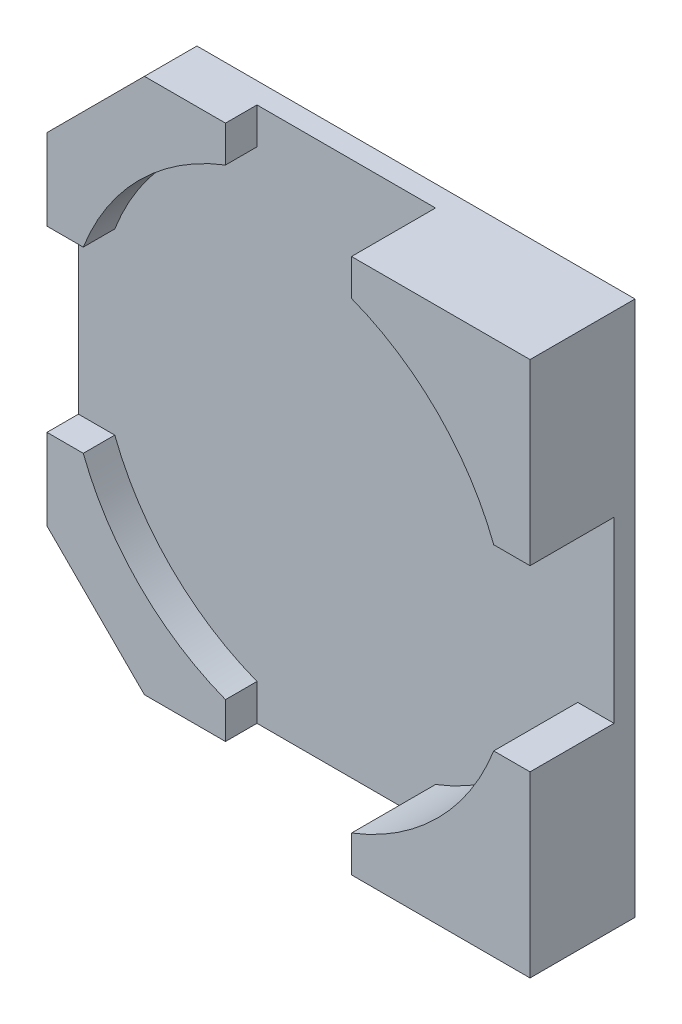
ISO-10303-21;
HEADER;
FILE_DESCRIPTION(('STEP AP214'),'2;1');
FILE_NAME('part.step','',(''),(''),'','','');
FILE_SCHEMA(('AUTOMOTIVE_DESIGN { 1 0 10303 214 1 1 1 1 }'));
ENDSEC;
DATA;
#1=APPLICATION_CONTEXT('core data for automotive mechanical design processes');
#2=APPLICATION_PROTOCOL_DEFINITION('international standard','automotive_design',2000,#1);
#3=PRODUCT_CONTEXT('',#1,'mechanical');
#4=PRODUCT('Part','Part','',(#3));
#5=PRODUCT_RELATED_PRODUCT_CATEGORY('part','',(#4));
#6=PRODUCT_DEFINITION_FORMATION('','',#4);
#7=PRODUCT_DEFINITION_CONTEXT('part definition',#1,'design');
#8=PRODUCT_DEFINITION('design','',#6,#7);
#9=PRODUCT_DEFINITION_SHAPE('','',#8);
#10=(LENGTH_UNIT() NAMED_UNIT(*) SI_UNIT(.MILLI.,.METRE.));
#11=(NAMED_UNIT(*) PLANE_ANGLE_UNIT() SI_UNIT($,.RADIAN.));
#12=(NAMED_UNIT(*) SI_UNIT($,.STERADIAN.) SOLID_ANGLE_UNIT());
#13=UNCERTAINTY_MEASURE_WITH_UNIT(LENGTH_MEASURE(1.E-05),#10,'distance_accuracy_value','');
#14=(GEOMETRIC_REPRESENTATION_CONTEXT(3) GLOBAL_UNCERTAINTY_ASSIGNED_CONTEXT((#13)) GLOBAL_UNIT_ASSIGNED_CONTEXT((#10,
#11,#12)) REPRESENTATION_CONTEXT('',''));
#15=CARTESIAN_POINT('',(0.,0.,0.));
#16=DIRECTION('',(0.,0.,1.));
#17=DIRECTION('',(1.,0.,0.));
#18=AXIS2_PLACEMENT_3D('',#15,#16,#17);
#19=CARTESIAN_POINT('',(0.,0.,0.266633333333));
#20=DIRECTION('',(0.,0.,1.));
#21=DIRECTION('',(1.,0.,0.));
#22=AXIS2_PLACEMENT_3D('',#19,#20,#21);
#23=CYLINDRICAL_SURFACE('',#22,3.15);
#24=CARTESIAN_POINT('',(0.,0.,0.666583333333));
#25=DIRECTION('',(0.,0.,1.));
#26=DIRECTION('',(1.,0.,0.));
#27=AXIS2_PLACEMENT_3D('',#24,#25,#26);
#28=CIRCLE('',#27,3.15);
#29=CARTESIAN_POINT('',(-1.13333333333295,-2.93905691601174,0.666583333333));
#30=VERTEX_POINT('',#29);
#31=CARTESIAN_POINT('',(-2.93905691601186,-1.133333333333,0.666583333333));
#32=VERTEX_POINT('',#31);
#33=EDGE_CURVE('E211',#30,#32,#28,.F.);
#34=ORIENTED_EDGE('',*,*,#33,.F.);
#35=DIRECTION('',(0.,0.,1.));
#36=VECTOR('',#35,1.);
#37=CARTESIAN_POINT('',(-1.13333333333291,-2.93905691601175,0.266633333333));
#38=LINE('',#37,#36);
#39=CARTESIAN_POINT('',(-1.133333333333,-2.93905691601186,0.266633333333));
#40=VERTEX_POINT('',#39);
#41=EDGE_CURVE('E345',#40,#30,#38,.T.);
#42=ORIENTED_EDGE('',*,*,#41,.F.);
#43=CARTESIAN_POINT('',(0.,0.,0.266633333333));
#44=DIRECTION('',(0.,0.,1.));
#45=DIRECTION('',(1.,0.,0.));
#46=AXIS2_PLACEMENT_3D('',#43,#44,#45);
#47=CIRCLE('',#46,3.15);
#48=CARTESIAN_POINT('',(-2.93905691601186,-1.133333333333,0.266633333333));
#49=VERTEX_POINT('',#48);
#50=EDGE_CURVE('E20',#49,#40,#47,.T.);
#51=ORIENTED_EDGE('',*,*,#50,.F.);
#52=DIRECTION('',(0.,0.,1.));
#53=VECTOR('',#52,1.);
#54=CARTESIAN_POINT('',(-2.939056916012,-1.133333333333,0.266633333333));
#55=LINE('',#54,#53);
#56=EDGE_CURVE('E216',#32,#49,#55,.F.);
#57=ORIENTED_EDGE('',*,*,#56,.F.);
#58=EDGE_LOOP('',(#34,#42,#51,#57));
#59=FACE_BOUND('',#58,.T.);
#60=ADVANCED_FACE('F17',(#59),#23,.F.);
#61=CARTESIAN_POINT('',(0.,0.,0.266633333333));
#62=DIRECTION('',(0.,0.,1.));
#63=DIRECTION('',(1.,0.,0.));
#64=AXIS2_PLACEMENT_3D('',#61,#62,#63);
#65=CYLINDRICAL_SURFACE('',#64,3.15);
#66=CARTESIAN_POINT('',(0.,0.,1.333166666667));
#67=DIRECTION('',(0.,0.,1.));
#68=DIRECTION('',(1.,0.,0.));
#69=AXIS2_PLACEMENT_3D('',#66,#67,#68);
#70=CIRCLE('',#69,3.15);
#71=CARTESIAN_POINT('',(2.93905691601174,-1.13333333333295,1.333166666667));
#72=VERTEX_POINT('',#71);
#73=CARTESIAN_POINT('',(1.133333333333,-2.93905691601186,1.333166666667));
#74=VERTEX_POINT('',#73);
#75=EDGE_CURVE('E200',#72,#74,#70,.F.);
#76=ORIENTED_EDGE('',*,*,#75,.F.);
#77=DIRECTION('',(0.,0.,1.));
#78=VECTOR('',#77,1.);
#79=CARTESIAN_POINT('',(2.93905691601175,-1.13333333333291,0.266633333333));
#80=LINE('',#79,#78);
#81=CARTESIAN_POINT('',(2.93905691601186,-1.133333333333,0.266633333333));
#82=VERTEX_POINT('',#81);
#83=EDGE_CURVE('E174',#82,#72,#80,.T.);
#84=ORIENTED_EDGE('',*,*,#83,.F.);
#85=CARTESIAN_POINT('',(0.,0.,0.266633333333));
#86=DIRECTION('',(0.,0.,1.));
#87=DIRECTION('',(1.,0.,0.));
#88=AXIS2_PLACEMENT_3D('',#85,#86,#87);
#89=CIRCLE('',#88,3.15);
#90=CARTESIAN_POINT('',(1.133333333333,-2.93905691601186,0.266633333333));
#91=VERTEX_POINT('',#90);
#92=EDGE_CURVE('E308',#91,#82,#89,.T.);
#93=ORIENTED_EDGE('',*,*,#92,.F.);
#94=DIRECTION('',(0.,0.,-1.));
#95=VECTOR('',#94,1.);
#96=CARTESIAN_POINT('',(1.133333333333,-2.939056916012,0.266633333333));
#97=LINE('',#96,#95);
#98=EDGE_CURVE('E294',#91,#74,#97,.F.);
#99=ORIENTED_EDGE('',*,*,#98,.T.);
#100=EDGE_LOOP('',(#76,#84,#93,#99));
#101=FACE_BOUND('',#100,.T.);
#102=ADVANCED_FACE('F375',(#101),#65,.F.);
#103=CARTESIAN_POINT('',(0.,0.,0.266633333333));
#104=DIRECTION('',(0.,0.,1.));
#105=DIRECTION('',(1.,0.,0.));
#106=AXIS2_PLACEMENT_3D('',#103,#104,#105);
#107=CYLINDRICAL_SURFACE('',#106,3.15);
#108=DIRECTION('',(0.,0.,-1.));
#109=VECTOR('',#108,1.);
#110=CARTESIAN_POINT('',(1.133333333333,2.939056916012,0.266633333333));
#111=LINE('',#110,#109);
#112=CARTESIAN_POINT('',(1.133333333333,2.93905691601186,1.333166666667));
#113=VERTEX_POINT('',#112);
#114=CARTESIAN_POINT('',(1.133333333333,2.93905691601186,0.266633333333));
#115=VERTEX_POINT('',#114);
#116=EDGE_CURVE('E168',#113,#115,#111,.T.);
#117=ORIENTED_EDGE('',*,*,#116,.T.);
#118=CARTESIAN_POINT('',(0.,0.,0.266633333333));
#119=DIRECTION('',(0.,0.,1.));
#120=DIRECTION('',(1.,0.,0.));
#121=AXIS2_PLACEMENT_3D('',#118,#119,#120);
#122=CIRCLE('',#121,3.15);
#123=CARTESIAN_POINT('',(2.93905691601186,1.133333333333,0.266633333333));
#124=VERTEX_POINT('',#123);
#125=EDGE_CURVE('E162',#124,#115,#122,.T.);
#126=ORIENTED_EDGE('',*,*,#125,.F.);
#127=DIRECTION('',(0.,0.,1.));
#128=VECTOR('',#127,1.);
#129=CARTESIAN_POINT('',(2.939056916012,1.133333333333,0.266633333333));
#130=LINE('',#129,#128);
#131=CARTESIAN_POINT('',(2.93905691601186,1.133333333333,1.333166666667));
#132=VERTEX_POINT('',#131);
#133=EDGE_CURVE('E166',#124,#132,#130,.T.);
#134=ORIENTED_EDGE('',*,*,#133,.T.);
#135=CARTESIAN_POINT('',(0.,0.,1.333166666667));
#136=DIRECTION('',(0.,0.,1.));
#137=DIRECTION('',(1.,0.,0.));
#138=AXIS2_PLACEMENT_3D('',#135,#136,#137);
#139=CIRCLE('',#138,3.15);
#140=EDGE_CURVE('E365',#113,#132,#139,.F.);
#141=ORIENTED_EDGE('',*,*,#140,.F.);
#142=EDGE_LOOP('',(#117,#126,#134,#141));
#143=FACE_BOUND('',#142,.T.);
#144=ADVANCED_FACE('F164',(#143),#107,.F.);
#145=CARTESIAN_POINT('',(0.,0.,0.266633333333));
#146=DIRECTION('',(0.,0.,1.));
#147=DIRECTION('',(1.,0.,0.));
#148=AXIS2_PLACEMENT_3D('',#145,#146,#147);
#149=CYLINDRICAL_SURFACE('',#148,3.15);
#150=DIRECTION('',(0.,0.,1.));
#151=VECTOR('',#150,1.);
#152=CARTESIAN_POINT('',(-2.939056916012,1.133333333333,0.266633333333));
#153=LINE('',#152,#151);
#154=CARTESIAN_POINT('',(-2.93905691601186,1.133333333333,0.666583333333));
#155=VERTEX_POINT('',#154);
#156=CARTESIAN_POINT('',(-2.93905691601186,1.133333333333,0.266633333333));
#157=VERTEX_POINT('',#156);
#158=EDGE_CURVE('E217',#155,#157,#153,.F.);
#159=ORIENTED_EDGE('',*,*,#158,.T.);
#160=CARTESIAN_POINT('',(0.,0.,0.266633333333));
#161=DIRECTION('',(0.,0.,1.));
#162=DIRECTION('',(1.,0.,0.));
#163=AXIS2_PLACEMENT_3D('',#160,#161,#162);
#164=CIRCLE('',#163,3.15);
#165=CARTESIAN_POINT('',(-1.133333333333,2.93905691601186,0.266633333333));
#166=VERTEX_POINT('',#165);
#167=EDGE_CURVE('E173',#166,#157,#164,.T.);
#168=ORIENTED_EDGE('',*,*,#167,.F.);
#169=DIRECTION('',(0.,0.,-1.));
#170=VECTOR('',#169,1.);
#171=CARTESIAN_POINT('',(-1.133333333333,2.939056916012,0.266633333333));
#172=LINE('',#171,#170);
#173=CARTESIAN_POINT('',(-1.133333333333,2.93905691601186,0.666583333333));
#174=VERTEX_POINT('',#173);
#175=EDGE_CURVE('E220',#174,#166,#172,.T.);
#176=ORIENTED_EDGE('',*,*,#175,.F.);
#177=CARTESIAN_POINT('',(0.,0.,0.666583333333));
#178=DIRECTION('',(0.,0.,1.));
#179=DIRECTION('',(1.,0.,0.));
#180=AXIS2_PLACEMENT_3D('',#177,#178,#179);
#181=CIRCLE('',#180,3.15);
#182=EDGE_CURVE('E362',#155,#174,#181,.F.);
#183=ORIENTED_EDGE('',*,*,#182,.F.);
#184=EDGE_LOOP('',(#159,#168,#176,#183));
#185=FACE_BOUND('',#184,.T.);
#186=ADVANCED_FACE('F423',(#185),#149,.F.);
#187=CARTESIAN_POINT('',(-3.4,1.133333333333,0.266633333333));
#188=DIRECTION('',(0.,1.,0.));
#189=DIRECTION('',(0.,0.,1.));
#190=AXIS2_PLACEMENT_3D('',#187,#188,#189);
#191=PLANE('',#190);
#192=ORIENTED_EDGE('',*,*,#158,.F.);
#193=DIRECTION('',(1.,0.,0.));
#194=VECTOR('',#193,1.);
#195=CARTESIAN_POINT('',(-3.4,1.133333333333,0.666583333333));
#196=LINE('',#195,#194);
#197=CARTESIAN_POINT('',(-3.4,1.133333333333,0.666583333333));
#198=VERTEX_POINT('',#197);
#199=EDGE_CURVE('E364',#198,#155,#196,.T.);
#200=ORIENTED_EDGE('',*,*,#199,.F.);
#201=DIRECTION('',(0.,0.,-1.));
#202=VECTOR('',#201,1.);
#203=CARTESIAN_POINT('',(-3.4,1.133333333333,0.));
#204=LINE('',#203,#202);
#205=CARTESIAN_POINT('',(-3.4,1.133333333333,0.266633333333));
#206=VERTEX_POINT('',#205);
#207=EDGE_CURVE('E237',#198,#206,#204,.T.);
#208=ORIENTED_EDGE('',*,*,#207,.T.);
#209=DIRECTION('',(1.,0.,0.));
#210=VECTOR('',#209,1.);
#211=CARTESIAN_POINT('',(-3.4,1.133333333333,0.266633333333));
#212=LINE('',#211,#210);
#213=EDGE_CURVE('E214',#157,#206,#212,.F.);
#214=ORIENTED_EDGE('',*,*,#213,.F.);
#215=EDGE_LOOP('',(#192,#200,#208,#214));
#216=FACE_BOUND('',#215,.T.);
#217=ADVANCED_FACE('F426',(#216),#191,.F.);
#218=CARTESIAN_POINT('',(-3.4,-1.133333333333,0.266633333333));
#219=DIRECTION('',(0.,1.,0.));
#220=DIRECTION('',(0.,0.,1.));
#221=AXIS2_PLACEMENT_3D('',#218,#219,#220);
#222=PLANE('',#221);
#223=ORIENTED_EDGE('',*,*,#56,.T.);
#224=DIRECTION('',(1.,0.,0.));
#225=VECTOR('',#224,1.);
#226=CARTESIAN_POINT('',(-3.4,-1.133333333333,0.266633333333));
#227=LINE('',#226,#225);
#228=CARTESIAN_POINT('',(-3.4,-1.133333333333,0.266633333333));
#229=VERTEX_POINT('',#228);
#230=EDGE_CURVE('E329',#49,#229,#227,.F.);
#231=ORIENTED_EDGE('',*,*,#230,.T.);
#232=DIRECTION('',(0.,0.,-1.));
#233=VECTOR('',#232,1.);
#234=CARTESIAN_POINT('',(-3.4,-1.133333333333,0.));
#235=LINE('',#234,#233);
#236=CARTESIAN_POINT('',(-3.4,-1.133333333333,0.666583333333));
#237=VERTEX_POINT('',#236);
#238=EDGE_CURVE('E339',#229,#237,#235,.F.);
#239=ORIENTED_EDGE('',*,*,#238,.T.);
#240=DIRECTION('',(1.,0.,0.));
#241=VECTOR('',#240,1.);
#242=CARTESIAN_POINT('',(-3.4,-1.133333333333,0.666583333333));
#243=LINE('',#242,#241);
#244=EDGE_CURVE('E209',#32,#237,#243,.F.);
#245=ORIENTED_EDGE('',*,*,#244,.F.);
#246=EDGE_LOOP('',(#223,#231,#239,#245));
#247=FACE_BOUND('',#246,.T.);
#248=ADVANCED_FACE('F437',(#247),#222,.T.);
#249=CARTESIAN_POINT('',(-3.4,-3.4,0.666583333333));
#250=DIRECTION('',(0.,0.,1.));
#251=DIRECTION('',(1.,0.,0.));
#252=AXIS2_PLACEMENT_3D('',#249,#250,#251);
#253=PLANE('',#252);
#254=ORIENTED_EDGE('',*,*,#33,.T.);
#255=ORIENTED_EDGE('',*,*,#244,.T.);
#256=DIRECTION('',(0.,1.,0.));
#257=VECTOR('',#256,1.);
#258=CARTESIAN_POINT('',(-3.4,-3.4,0.666583333333));
#259=LINE('',#258,#257);
#260=CARTESIAN_POINT('',(-3.4,-2.1625,0.666583333333));
#261=VERTEX_POINT('',#260);
#262=EDGE_CURVE('E246',#237,#261,#259,.F.);
#263=ORIENTED_EDGE('',*,*,#262,.T.);
#264=DIRECTION('',(0.707106781186548,-0.707106781186548,0.));
#265=VECTOR('',#264,1.);
#266=CARTESIAN_POINT('',(-2.1625,-3.4,0.666583333333));
#267=LINE('',#266,#265);
#268=CARTESIAN_POINT('',(-2.1625,-3.4,0.666583333333));
#269=VERTEX_POINT('',#268);
#270=EDGE_CURVE('E342',#269,#261,#267,.F.);
#271=ORIENTED_EDGE('',*,*,#270,.F.);
#272=DIRECTION('',(1.,0.,0.));
#273=VECTOR('',#272,1.);
#274=CARTESIAN_POINT('',(-3.4,-3.4,0.666583333333));
#275=LINE('',#274,#273);
#276=CARTESIAN_POINT('',(-1.133333333333,-3.4,0.666583333333));
#277=VERTEX_POINT('',#276);
#278=EDGE_CURVE('E327',#269,#277,#275,.T.);
#279=ORIENTED_EDGE('',*,*,#278,.T.);
#280=DIRECTION('',(0.,1.,0.));
#281=VECTOR('',#280,1.);
#282=CARTESIAN_POINT('',(-1.133333333333,-3.4,0.666583333333));
#283=LINE('',#282,#281);
#284=EDGE_CURVE('E206',#30,#277,#283,.F.);
#285=ORIENTED_EDGE('',*,*,#284,.F.);
#286=EDGE_LOOP('',(#254,#255,#263,#271,#279,#285));
#287=FACE_BOUND('',#286,.T.);
#288=ADVANCED_FACE('F449',(#287),#253,.T.);
#289=CARTESIAN_POINT('',(-1.133333333333,-3.4,0.266633333333));
#290=DIRECTION('',(1.,0.,0.));
#291=DIRECTION('',(0.,0.,-1.));
#292=AXIS2_PLACEMENT_3D('',#289,#290,#291);
#293=PLANE('',#292);
#294=ORIENTED_EDGE('',*,*,#41,.T.);
#295=ORIENTED_EDGE('',*,*,#284,.T.);
#296=DIRECTION('',(0.,0.,1.));
#297=VECTOR('',#296,1.);
#298=CARTESIAN_POINT('',(-1.133333333333,-3.4,0.));
#299=LINE('',#298,#297);
#300=CARTESIAN_POINT('',(-1.133333333333,-3.4,0.266633333333));
#301=VERTEX_POINT('',#300);
#302=EDGE_CURVE('E315',#277,#301,#299,.F.);
#303=ORIENTED_EDGE('',*,*,#302,.T.);
#304=DIRECTION('',(0.,1.,0.));
#305=VECTOR('',#304,1.);
#306=CARTESIAN_POINT('',(-1.133333333333,-3.4,0.266633333333));
#307=LINE('',#306,#305);
#308=EDGE_CURVE('E203',#40,#301,#307,.F.);
#309=ORIENTED_EDGE('',*,*,#308,.F.);
#310=EDGE_LOOP('',(#294,#295,#303,#309));
#311=FACE_BOUND('',#310,.T.);
#312=ADVANCED_FACE('F445',(#311),#293,.T.);
#313=CARTESIAN_POINT('',(1.133333333333,-3.4,0.266633333333));
#314=DIRECTION('',(1.,0.,0.));
#315=DIRECTION('',(0.,0.,-1.));
#316=AXIS2_PLACEMENT_3D('',#313,#314,#315);
#317=PLANE('',#316);
#318=ORIENTED_EDGE('',*,*,#98,.F.);
#319=DIRECTION('',(0.,1.,0.));
#320=VECTOR('',#319,1.);
#321=CARTESIAN_POINT('',(1.133333333333,-3.4,0.266633333333));
#322=LINE('',#321,#320);
#323=CARTESIAN_POINT('',(1.133333333333,-3.4,0.266633333333));
#324=VERTEX_POINT('',#323);
#325=EDGE_CURVE('E205',#324,#91,#322,.T.);
#326=ORIENTED_EDGE('',*,*,#325,.F.);
#327=DIRECTION('',(0.,0.,1.));
#328=VECTOR('',#327,1.);
#329=CARTESIAN_POINT('',(1.133333333333,-3.4,0.));
#330=LINE('',#329,#328);
#331=CARTESIAN_POINT('',(1.133333333333,-3.4,1.333166666667));
#332=VERTEX_POINT('',#331);
#333=EDGE_CURVE('E299',#324,#332,#330,.T.);
#334=ORIENTED_EDGE('',*,*,#333,.T.);
#335=DIRECTION('',(0.,1.,0.));
#336=VECTOR('',#335,1.);
#337=CARTESIAN_POINT('',(1.133333333333,-3.4,1.333166666667));
#338=LINE('',#337,#336);
#339=EDGE_CURVE('E183',#74,#332,#338,.F.);
#340=ORIENTED_EDGE('',*,*,#339,.F.);
#341=EDGE_LOOP('',(#318,#326,#334,#340));
#342=FACE_BOUND('',#341,.T.);
#343=ADVANCED_FACE('F378',(#342),#317,.F.);
#344=CARTESIAN_POINT('',(-3.4,-3.4,1.333166666667));
#345=DIRECTION('',(0.,0.,1.));
#346=DIRECTION('',(1.,0.,0.));
#347=AXIS2_PLACEMENT_3D('',#344,#345,#346);
#348=PLANE('',#347);
#349=ORIENTED_EDGE('',*,*,#339,.T.);
#350=DIRECTION('',(1.,0.,0.));
#351=VECTOR('',#350,1.);
#352=CARTESIAN_POINT('',(-3.4,-3.4,1.333166666667));
#353=LINE('',#352,#351);
#354=CARTESIAN_POINT('',(3.4,-3.4,1.333166666667));
#355=VERTEX_POINT('',#354);
#356=EDGE_CURVE('E286',#332,#355,#353,.T.);
#357=ORIENTED_EDGE('',*,*,#356,.T.);
#358=DIRECTION('',(0.,1.,0.));
#359=VECTOR('',#358,1.);
#360=CARTESIAN_POINT('',(3.4,-3.4,1.333166666667));
#361=LINE('',#360,#359);
#362=CARTESIAN_POINT('',(3.4,-1.133333333333,1.333166666667));
#363=VERTEX_POINT('',#362);
#364=EDGE_CURVE('E284',#363,#355,#361,.F.);
#365=ORIENTED_EDGE('',*,*,#364,.F.);
#366=DIRECTION('',(1.,0.,0.));
#367=VECTOR('',#366,1.);
#368=CARTESIAN_POINT('',(-3.4,-1.133333333333,1.333166666667));
#369=LINE('',#368,#367);
#370=EDGE_CURVE('E191',#72,#363,#369,.T.);
#371=ORIENTED_EDGE('',*,*,#370,.F.);
#372=ORIENTED_EDGE('',*,*,#75,.T.);
#373=EDGE_LOOP('',(#349,#357,#365,#371,#372));
#374=FACE_BOUND('',#373,.T.);
#375=ADVANCED_FACE('F382',(#374),#348,.T.);
#376=CARTESIAN_POINT('',(-3.4,1.133333333333,0.266633333333));
#377=DIRECTION('',(0.,1.,0.));
#378=DIRECTION('',(0.,0.,1.));
#379=AXIS2_PLACEMENT_3D('',#376,#377,#378);
#380=PLANE('',#379);
#381=ORIENTED_EDGE('',*,*,#133,.F.);
#382=DIRECTION('',(1.,0.,0.));
#383=VECTOR('',#382,1.);
#384=CARTESIAN_POINT('',(-3.4,1.133333333333,0.266633333333));
#385=LINE('',#384,#383);
#386=CARTESIAN_POINT('',(3.4,1.133333333333,0.266633333333));
#387=VERTEX_POINT('',#386);
#388=EDGE_CURVE('E180',#387,#124,#385,.F.);
#389=ORIENTED_EDGE('',*,*,#388,.F.);
#390=DIRECTION('',(0.,0.,-1.));
#391=VECTOR('',#390,1.);
#392=CARTESIAN_POINT('',(3.4,1.133333333333,0.));
#393=LINE('',#392,#391);
#394=CARTESIAN_POINT('',(3.4,1.133333333333,1.333166666667));
#395=VERTEX_POINT('',#394);
#396=EDGE_CURVE('E252',#395,#387,#393,.T.);
#397=ORIENTED_EDGE('',*,*,#396,.F.);
#398=DIRECTION('',(1.,0.,0.));
#399=VECTOR('',#398,1.);
#400=CARTESIAN_POINT('',(-3.4,1.133333333333,1.333166666667));
#401=LINE('',#400,#399);
#402=EDGE_CURVE('E182',#132,#395,#401,.T.);
#403=ORIENTED_EDGE('',*,*,#402,.F.);
#404=EDGE_LOOP('',(#381,#389,#397,#403));
#405=FACE_BOUND('',#404,.T.);
#406=ADVANCED_FACE('F178',(#405),#380,.F.);
#407=CARTESIAN_POINT('',(-3.4,-1.133333333333,0.266633333333));
#408=DIRECTION('',(0.,1.,0.));
#409=DIRECTION('',(0.,0.,1.));
#410=AXIS2_PLACEMENT_3D('',#407,#408,#409);
#411=PLANE('',#410);
#412=ORIENTED_EDGE('',*,*,#83,.T.);
#413=ORIENTED_EDGE('',*,*,#370,.T.);
#414=DIRECTION('',(0.,0.,-1.));
#415=VECTOR('',#414,1.);
#416=CARTESIAN_POINT('',(3.4,-1.133333333333,0.));
#417=LINE('',#416,#415);
#418=CARTESIAN_POINT('',(3.4,-1.133333333333,0.266633333333));
#419=VERTEX_POINT('',#418);
#420=EDGE_CURVE('E228',#419,#363,#417,.F.);
#421=ORIENTED_EDGE('',*,*,#420,.F.);
#422=DIRECTION('',(1.,0.,0.));
#423=VECTOR('',#422,1.);
#424=CARTESIAN_POINT('',(-3.4,-1.133333333333,0.266633333333));
#425=LINE('',#424,#423);
#426=EDGE_CURVE('E188',#419,#82,#425,.F.);
#427=ORIENTED_EDGE('',*,*,#426,.T.);
#428=EDGE_LOOP('',(#412,#413,#421,#427));
#429=FACE_BOUND('',#428,.T.);
#430=ADVANCED_FACE('F580',(#429),#411,.T.);
#431=CARTESIAN_POINT('',(-1.133333333333,-3.4,0.266633333333));
#432=DIRECTION('',(1.,0.,0.));
#433=DIRECTION('',(0.,0.,-1.));
#434=AXIS2_PLACEMENT_3D('',#431,#432,#433);
#435=PLANE('',#434);
#436=ORIENTED_EDGE('',*,*,#175,.T.);
#437=DIRECTION('',(0.,1.,0.));
#438=VECTOR('',#437,1.);
#439=CARTESIAN_POINT('',(-1.133333333333,-3.4,0.266633333333));
#440=LINE('',#439,#438);
#441=CARTESIAN_POINT('',(-1.133333333333,3.4,0.266633333333));
#442=VERTEX_POINT('',#441);
#443=EDGE_CURVE('E223',#442,#166,#440,.F.);
#444=ORIENTED_EDGE('',*,*,#443,.F.);
#445=DIRECTION('',(0.,0.,1.));
#446=VECTOR('',#445,1.);
#447=CARTESIAN_POINT('',(-1.133333333333,3.4,0.));
#448=LINE('',#447,#446);
#449=CARTESIAN_POINT('',(-1.133333333333,3.4,0.666583333333));
#450=VERTEX_POINT('',#449);
#451=EDGE_CURVE('E227',#450,#442,#448,.F.);
#452=ORIENTED_EDGE('',*,*,#451,.F.);
#453=DIRECTION('',(0.,1.,0.));
#454=VECTOR('',#453,1.);
#455=CARTESIAN_POINT('',(-1.133333333333,-3.4,0.666583333333));
#456=LINE('',#455,#454);
#457=EDGE_CURVE('E336',#174,#450,#456,.T.);
#458=ORIENTED_EDGE('',*,*,#457,.F.);
#459=EDGE_LOOP('',(#436,#444,#452,#458));
#460=FACE_BOUND('',#459,.T.);
#461=ADVANCED_FACE('F418',(#460),#435,.T.);
#462=CARTESIAN_POINT('',(-1.133333333333,-3.4,0.266633333333));
#463=DIRECTION('',(0.,0.,1.));
#464=DIRECTION('',(1.,0.,0.));
#465=AXIS2_PLACEMENT_3D('',#462,#463,#464);
#466=PLANE('',#465);
#467=ORIENTED_EDGE('',*,*,#167,.T.);
#468=ORIENTED_EDGE('',*,*,#213,.T.);
#469=DIRECTION('',(0.,1.,0.));
#470=VECTOR('',#469,1.);
#471=CARTESIAN_POINT('',(-3.4,-3.4,0.266633333333));
#472=LINE('',#471,#470);
#473=EDGE_CURVE('E240',#206,#229,#472,.F.);
#474=ORIENTED_EDGE('',*,*,#473,.T.);
#475=ORIENTED_EDGE('',*,*,#230,.F.);
#476=ORIENTED_EDGE('',*,*,#50,.T.);
#477=ORIENTED_EDGE('',*,*,#308,.T.);
#478=DIRECTION('',(1.,0.,0.));
#479=VECTOR('',#478,1.);
#480=CARTESIAN_POINT('',(-3.4,-3.4,0.266633333333));
#481=LINE('',#480,#479);
#482=EDGE_CURVE('E304',#301,#324,#481,.T.);
#483=ORIENTED_EDGE('',*,*,#482,.T.);
#484=ORIENTED_EDGE('',*,*,#325,.T.);
#485=ORIENTED_EDGE('',*,*,#92,.T.);
#486=ORIENTED_EDGE('',*,*,#426,.F.);
#487=DIRECTION('',(0.,1.,0.));
#488=VECTOR('',#487,1.);
#489=CARTESIAN_POINT('',(3.4,-3.4,0.266633333333));
#490=LINE('',#489,#488);
#491=EDGE_CURVE('E187',#387,#419,#490,.F.);
#492=ORIENTED_EDGE('',*,*,#491,.F.);
#493=ORIENTED_EDGE('',*,*,#388,.T.);
#494=ORIENTED_EDGE('',*,*,#125,.T.);
#495=DIRECTION('',(0.,1.,0.));
#496=VECTOR('',#495,1.);
#497=CARTESIAN_POINT('',(1.133333333333,-3.4,0.266633333333));
#498=LINE('',#497,#496);
#499=CARTESIAN_POINT('',(1.133333333333,3.4,0.266633333333));
#500=VERTEX_POINT('',#499);
#501=EDGE_CURVE('E260',#115,#500,#498,.T.);
#502=ORIENTED_EDGE('',*,*,#501,.T.);
#503=DIRECTION('',(1.,0.,0.));
#504=VECTOR('',#503,1.);
#505=CARTESIAN_POINT('',(-3.4,3.4,0.266633333333));
#506=LINE('',#505,#504);
#507=EDGE_CURVE('E232',#442,#500,#506,.T.);
#508=ORIENTED_EDGE('',*,*,#507,.F.);
#509=ORIENTED_EDGE('',*,*,#443,.T.);
#510=EDGE_LOOP('',(#467,#468,#474,#475,#476,#477,#483,#484,#485,#486,#492,#493,#494,#502,#508,#509));
#511=FACE_BOUND('',#510,.T.);
#512=ADVANCED_FACE('F185',(#511),#466,.T.);
#513=CARTESIAN_POINT('',(1.133333333333,-3.4,0.266633333333));
#514=DIRECTION('',(1.,0.,0.));
#515=DIRECTION('',(0.,0.,-1.));
#516=AXIS2_PLACEMENT_3D('',#513,#514,#515);
#517=PLANE('',#516);
#518=ORIENTED_EDGE('',*,*,#501,.F.);
#519=ORIENTED_EDGE('',*,*,#116,.F.);
#520=DIRECTION('',(0.,1.,0.));
#521=VECTOR('',#520,1.);
#522=CARTESIAN_POINT('',(1.133333333333,-3.4,1.333166666667));
#523=LINE('',#522,#521);
#524=CARTESIAN_POINT('',(1.133333333333,3.4,1.333166666667));
#525=VERTEX_POINT('',#524);
#526=EDGE_CURVE('E271',#525,#113,#523,.F.);
#527=ORIENTED_EDGE('',*,*,#526,.F.);
#528=DIRECTION('',(0.,0.,1.));
#529=VECTOR('',#528,1.);
#530=CARTESIAN_POINT('',(1.133333333333,3.4,0.));
#531=LINE('',#530,#529);
#532=EDGE_CURVE('E261',#500,#525,#531,.T.);
#533=ORIENTED_EDGE('',*,*,#532,.F.);
#534=EDGE_LOOP('',(#518,#519,#527,#533));
#535=FACE_BOUND('',#534,.T.);
#536=ADVANCED_FACE('F553',(#535),#517,.F.);
#537=CARTESIAN_POINT('',(-3.4,-3.4,1.333166666667));
#538=DIRECTION('',(0.,0.,1.));
#539=DIRECTION('',(1.,0.,0.));
#540=AXIS2_PLACEMENT_3D('',#537,#538,#539);
#541=PLANE('',#540);
#542=DIRECTION('',(0.,1.,0.));
#543=VECTOR('',#542,1.);
#544=CARTESIAN_POINT('',(3.4,-3.4,1.333166666667));
#545=LINE('',#544,#543);
#546=CARTESIAN_POINT('',(3.4,3.4,1.333166666667));
#547=VERTEX_POINT('',#546);
#548=EDGE_CURVE('E249',#547,#395,#545,.F.);
#549=ORIENTED_EDGE('',*,*,#548,.F.);
#550=DIRECTION('',(1.,0.,0.));
#551=VECTOR('',#550,1.);
#552=CARTESIAN_POINT('',(-3.4,3.4,1.333166666667));
#553=LINE('',#552,#551);
#554=EDGE_CURVE('E263',#525,#547,#553,.T.);
#555=ORIENTED_EDGE('',*,*,#554,.F.);
#556=ORIENTED_EDGE('',*,*,#526,.T.);
#557=ORIENTED_EDGE('',*,*,#140,.T.);
#558=ORIENTED_EDGE('',*,*,#402,.T.);
#559=EDGE_LOOP('',(#549,#555,#556,#557,#558));
#560=FACE_BOUND('',#559,.T.);
#561=ADVANCED_FACE('F543',(#560),#541,.T.);
#562=CARTESIAN_POINT('',(-3.4,-3.4,0.666583333333));
#563=DIRECTION('',(0.,0.,1.));
#564=DIRECTION('',(1.,0.,0.));
#565=AXIS2_PLACEMENT_3D('',#562,#563,#564);
#566=PLANE('',#565);
#567=DIRECTION('',(1.,0.,0.));
#568=VECTOR('',#567,1.);
#569=CARTESIAN_POINT('',(-3.4,3.4,0.666583333333));
#570=LINE('',#569,#568);
#571=CARTESIAN_POINT('',(-2.1625,3.4,0.666583333333));
#572=VERTEX_POINT('',#571);
#573=EDGE_CURVE('E224',#572,#450,#570,.T.);
#574=ORIENTED_EDGE('',*,*,#573,.F.);
#575=DIRECTION('',(-0.707106781186548,-0.707106781186548,0.));
#576=VECTOR('',#575,1.);
#577=CARTESIAN_POINT('',(-2.1625,3.4,0.666583333333));
#578=LINE('',#577,#576);
#579=CARTESIAN_POINT('',(-3.4,2.1625,0.666583333333));
#580=VERTEX_POINT('',#579);
#581=EDGE_CURVE('E465',#580,#572,#578,.F.);
#582=ORIENTED_EDGE('',*,*,#581,.F.);
#583=DIRECTION('',(0.,1.,0.));
#584=VECTOR('',#583,1.);
#585=CARTESIAN_POINT('',(-3.4,-3.4,0.666583333333));
#586=LINE('',#585,#584);
#587=EDGE_CURVE('E241',#580,#198,#586,.F.);
#588=ORIENTED_EDGE('',*,*,#587,.T.);
#589=ORIENTED_EDGE('',*,*,#199,.T.);
#590=ORIENTED_EDGE('',*,*,#182,.T.);
#591=ORIENTED_EDGE('',*,*,#457,.T.);
#592=EDGE_LOOP('',(#574,#582,#588,#589,#590,#591));
#593=FACE_BOUND('',#592,.T.);
#594=ADVANCED_FACE('F534',(#593),#566,.T.);
#595=CARTESIAN_POINT('',(-3.4,-3.4,0.));
#596=DIRECTION('',(1.,0.,0.));
#597=DIRECTION('',(0.,0.,-1.));
#598=AXIS2_PLACEMENT_3D('',#595,#596,#597);
#599=PLANE('',#598);
#600=ORIENTED_EDGE('',*,*,#473,.F.);
#601=ORIENTED_EDGE('',*,*,#207,.F.);
#602=ORIENTED_EDGE('',*,*,#587,.F.);
#603=DIRECTION('',(0.,0.,1.));
#604=VECTOR('',#603,1.);
#605=CARTESIAN_POINT('',(-3.4,2.1625,0.));
#606=LINE('',#605,#604);
#607=CARTESIAN_POINT('',(-3.4,2.1625,0.));
#608=VERTEX_POINT('',#607);
#609=EDGE_CURVE('E466',#608,#580,#606,.T.);
#610=ORIENTED_EDGE('',*,*,#609,.F.);
#611=DIRECTION('',(0.,1.,0.));
#612=VECTOR('',#611,1.);
#613=CARTESIAN_POINT('',(-3.4,-3.4,0.));
#614=LINE('',#613,#612);
#615=CARTESIAN_POINT('',(-3.4,-2.1625,0.));
#616=VERTEX_POINT('',#615);
#617=EDGE_CURVE('E457',#608,#616,#614,.F.);
#618=ORIENTED_EDGE('',*,*,#617,.T.);
#619=DIRECTION('',(0.,0.,1.));
#620=VECTOR('',#619,1.);
#621=CARTESIAN_POINT('',(-3.4,-2.1625,0.));
#622=LINE('',#621,#620);
#623=EDGE_CURVE('E348',#261,#616,#622,.F.);
#624=ORIENTED_EDGE('',*,*,#623,.F.);
#625=ORIENTED_EDGE('',*,*,#262,.F.);
#626=ORIENTED_EDGE('',*,*,#238,.F.);
#627=EDGE_LOOP('',(#600,#601,#602,#610,#618,#624,#625,#626));
#628=FACE_BOUND('',#627,.T.);
#629=ADVANCED_FACE('F432',(#628),#599,.F.);
#630=CARTESIAN_POINT('',(-2.1625,-3.4,0.));
#631=DIRECTION('',(-0.707106781186548,-0.707106781186548,0.));
#632=DIRECTION('',(0.707106781186548,-0.707106781186548,0.));
#633=AXIS2_PLACEMENT_3D('',#630,#631,#632);
#634=PLANE('',#633);
#635=ORIENTED_EDGE('',*,*,#270,.T.);
#636=ORIENTED_EDGE('',*,*,#623,.T.);
#637=DIRECTION('',(0.707106781186548,-0.707106781186548,0.));
#638=VECTOR('',#637,1.);
#639=CARTESIAN_POINT('',(-3.4,-2.1625,0.));
#640=LINE('',#639,#638);
#641=CARTESIAN_POINT('',(-2.1625,-3.4,0.));
#642=VERTEX_POINT('',#641);
#643=EDGE_CURVE('E454',#616,#642,#640,.T.);
#644=ORIENTED_EDGE('',*,*,#643,.T.);
#645=DIRECTION('',(0.,0.,1.));
#646=VECTOR('',#645,1.);
#647=CARTESIAN_POINT('',(-2.1625,-3.4,0.));
#648=LINE('',#647,#646);
#649=EDGE_CURVE('E320',#642,#269,#648,.T.);
#650=ORIENTED_EDGE('',*,*,#649,.T.);
#651=EDGE_LOOP('',(#635,#636,#644,#650));
#652=FACE_BOUND('',#651,.T.);
#653=ADVANCED_FACE('F452',(#652),#634,.T.);
#654=CARTESIAN_POINT('',(-3.4,-3.4,0.));
#655=DIRECTION('',(0.,1.,0.));
#656=DIRECTION('',(0.,0.,1.));
#657=AXIS2_PLACEMENT_3D('',#654,#655,#656);
#658=PLANE('',#657);
#659=ORIENTED_EDGE('',*,*,#356,.F.);
#660=ORIENTED_EDGE('',*,*,#333,.F.);
#661=ORIENTED_EDGE('',*,*,#482,.F.);
#662=ORIENTED_EDGE('',*,*,#302,.F.);
#663=ORIENTED_EDGE('',*,*,#278,.F.);
#664=ORIENTED_EDGE('',*,*,#649,.F.);
#665=DIRECTION('',(1.,0.,0.));
#666=VECTOR('',#665,1.);
#667=CARTESIAN_POINT('',(-3.4,-3.4,0.));
#668=LINE('',#667,#666);
#669=CARTESIAN_POINT('',(3.4,-3.4,0.));
#670=VERTEX_POINT('',#669);
#671=EDGE_CURVE('E391',#642,#670,#668,.T.);
#672=ORIENTED_EDGE('',*,*,#671,.T.);
#673=DIRECTION('',(0.,0.,-1.));
#674=VECTOR('',#673,1.);
#675=CARTESIAN_POINT('',(3.4,-3.4,0.));
#676=LINE('',#675,#674);
#677=EDGE_CURVE('E253',#355,#670,#676,.T.);
#678=ORIENTED_EDGE('',*,*,#677,.F.);
#679=EDGE_LOOP('',(#659,#660,#661,#662,#663,#664,#672,#678));
#680=FACE_BOUND('',#679,.T.);
#681=ADVANCED_FACE('F387',(#680),#658,.F.);
#682=CARTESIAN_POINT('',(3.4,-3.4,0.));
#683=DIRECTION('',(1.,0.,0.));
#684=DIRECTION('',(0.,0.,-1.));
#685=AXIS2_PLACEMENT_3D('',#682,#683,#684);
#686=PLANE('',#685);
#687=ORIENTED_EDGE('',*,*,#491,.T.);
#688=ORIENTED_EDGE('',*,*,#420,.T.);
#689=ORIENTED_EDGE('',*,*,#364,.T.);
#690=ORIENTED_EDGE('',*,*,#677,.T.);
#691=DIRECTION('',(0.,1.,0.));
#692=VECTOR('',#691,1.);
#693=CARTESIAN_POINT('',(3.4,-3.4,0.));
#694=LINE('',#693,#692);
#695=CARTESIAN_POINT('',(3.4,3.4,0.));
#696=VERTEX_POINT('',#695);
#697=EDGE_CURVE('E459',#670,#696,#694,.T.);
#698=ORIENTED_EDGE('',*,*,#697,.T.);
#699=DIRECTION('',(0.,0.,1.));
#700=VECTOR('',#699,1.);
#701=CARTESIAN_POINT('',(3.4,3.4,0.));
#702=LINE('',#701,#700);
#703=EDGE_CURVE('E267',#547,#696,#702,.F.);
#704=ORIENTED_EDGE('',*,*,#703,.F.);
#705=ORIENTED_EDGE('',*,*,#548,.T.);
#706=ORIENTED_EDGE('',*,*,#396,.T.);
#707=EDGE_LOOP('',(#687,#688,#689,#690,#698,#704,#705,#706));
#708=FACE_BOUND('',#707,.T.);
#709=ADVANCED_FACE('F479',(#708),#686,.T.);
#710=CARTESIAN_POINT('',(-3.4,3.4,0.));
#711=DIRECTION('',(0.,1.,0.));
#712=DIRECTION('',(0.,0.,1.));
#713=AXIS2_PLACEMENT_3D('',#710,#711,#712);
#714=PLANE('',#713);
#715=ORIENTED_EDGE('',*,*,#554,.T.);
#716=ORIENTED_EDGE('',*,*,#703,.T.);
#717=DIRECTION('',(1.,0.,0.));
#718=VECTOR('',#717,1.);
#719=CARTESIAN_POINT('',(-3.4,3.4,0.));
#720=LINE('',#719,#718);
#721=CARTESIAN_POINT('',(-2.1625,3.4,0.));
#722=VERTEX_POINT('',#721);
#723=EDGE_CURVE('E26',#696,#722,#720,.F.);
#724=ORIENTED_EDGE('',*,*,#723,.T.);
#725=DIRECTION('',(0.,0.,1.));
#726=VECTOR('',#725,1.);
#727=CARTESIAN_POINT('',(-2.1625,3.4,0.));
#728=LINE('',#727,#726);
#729=EDGE_CURVE('E34',#572,#722,#728,.F.);
#730=ORIENTED_EDGE('',*,*,#729,.F.);
#731=ORIENTED_EDGE('',*,*,#573,.T.);
#732=ORIENTED_EDGE('',*,*,#451,.T.);
#733=ORIENTED_EDGE('',*,*,#507,.T.);
#734=ORIENTED_EDGE('',*,*,#532,.T.);
#735=EDGE_LOOP('',(#715,#716,#724,#730,#731,#732,#733,#734));
#736=FACE_BOUND('',#735,.T.);
#737=ADVANCED_FACE('F474',(#736),#714,.T.);
#738=CARTESIAN_POINT('',(-2.1625,3.4,0.));
#739=DIRECTION('',(-0.707106781186548,0.707106781186548,0.));
#740=DIRECTION('',(-0.707106781186548,-0.707106781186548,0.));
#741=AXIS2_PLACEMENT_3D('',#738,#739,#740);
#742=PLANE('',#741);
#743=ORIENTED_EDGE('',*,*,#729,.T.);
#744=DIRECTION('',(-0.707106781186548,-0.707106781186548,0.));
#745=VECTOR('',#744,1.);
#746=CARTESIAN_POINT('',(-2.1625,3.4,0.));
#747=LINE('',#746,#745);
#748=EDGE_CURVE('E11',#722,#608,#747,.T.);
#749=ORIENTED_EDGE('',*,*,#748,.T.);
#750=ORIENTED_EDGE('',*,*,#609,.T.);
#751=ORIENTED_EDGE('',*,*,#581,.T.);
#752=EDGE_LOOP('',(#743,#749,#750,#751));
#753=FACE_BOUND('',#752,.T.);
#754=ADVANCED_FACE('F487',(#753),#742,.T.);
#755=CARTESIAN_POINT('',(-3.4,-3.4,0.));
#756=DIRECTION('',(0.,0.,1.));
#757=DIRECTION('',(1.,0.,0.));
#758=AXIS2_PLACEMENT_3D('',#755,#756,#757);
#759=PLANE('',#758);
#760=ORIENTED_EDGE('',*,*,#723,.F.);
#761=ORIENTED_EDGE('',*,*,#697,.F.);
#762=ORIENTED_EDGE('',*,*,#671,.F.);
#763=ORIENTED_EDGE('',*,*,#643,.F.);
#764=ORIENTED_EDGE('',*,*,#617,.F.);
#765=ORIENTED_EDGE('',*,*,#748,.F.);
#766=EDGE_LOOP('',(#760,#761,#762,#763,#764,#765));
#767=FACE_BOUND('',#766,.T.);
#768=ADVANCED_FACE('F477',(#767),#759,.F.);
#769=CLOSED_SHELL('',(#60,#102,#144,#186,#217,#248,#288,#312,#343,#375,#406,#430,#461,#512,#536,
#561,#594,#629,#653,#681,#709,#737,#754,#768));
#770=MANIFOLD_SOLID_BREP('B1',#769);
#771=ADVANCED_BREP_SHAPE_REPRESENTATION('',(#18,#770),#14);
#772=SHAPE_DEFINITION_REPRESENTATION(#9,#771);
ENDSEC;
END-ISO-10303-21;
